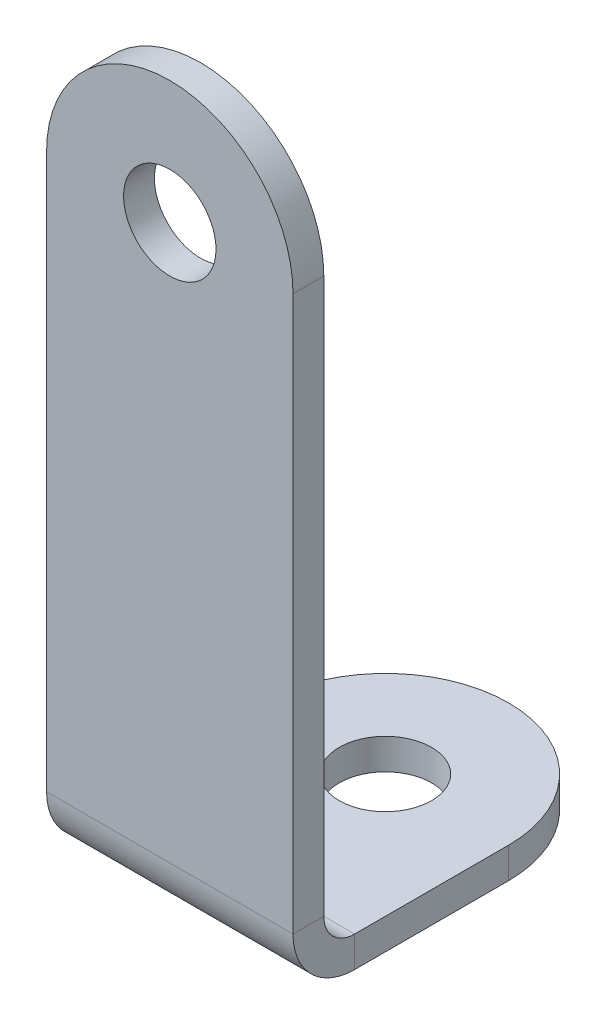
ISO-10303-21;
HEADER;
FILE_DESCRIPTION(('STEP AP214'),'2;1');
FILE_NAME('part.step','',(''),(''),'','','');
FILE_SCHEMA(('AUTOMOTIVE_DESIGN { 1 0 10303 214 1 1 1 1 }'));
ENDSEC;
DATA;
#1=APPLICATION_CONTEXT('core data for automotive mechanical design processes');
#2=APPLICATION_PROTOCOL_DEFINITION('international standard','automotive_design',2000,#1);
#3=PRODUCT_CONTEXT('',#1,'mechanical');
#4=PRODUCT('Part','Part','',(#3));
#5=PRODUCT_RELATED_PRODUCT_CATEGORY('part','',(#4));
#6=PRODUCT_DEFINITION_FORMATION('','',#4);
#7=PRODUCT_DEFINITION_CONTEXT('part definition',#1,'design');
#8=PRODUCT_DEFINITION('design','',#6,#7);
#9=PRODUCT_DEFINITION_SHAPE('','',#8);
#10=(LENGTH_UNIT() NAMED_UNIT(*) SI_UNIT(.MILLI.,.METRE.));
#11=(NAMED_UNIT(*) PLANE_ANGLE_UNIT() SI_UNIT($,.RADIAN.));
#12=(NAMED_UNIT(*) SI_UNIT($,.STERADIAN.) SOLID_ANGLE_UNIT());
#13=UNCERTAINTY_MEASURE_WITH_UNIT(LENGTH_MEASURE(1.E-05),#10,'distance_accuracy_value','');
#14=(GEOMETRIC_REPRESENTATION_CONTEXT(3) GLOBAL_UNCERTAINTY_ASSIGNED_CONTEXT((#13)) GLOBAL_UNIT_ASSIGNED_CONTEXT((#10,
#11,#12)) REPRESENTATION_CONTEXT('',''));
#15=CARTESIAN_POINT('',(0.,0.,0.));
#16=DIRECTION('',(0.,0.,1.));
#17=DIRECTION('',(1.,0.,0.));
#18=AXIS2_PLACEMENT_3D('',#15,#16,#17);
#19=CARTESIAN_POINT('',(-4.,23.,0.));
#20=DIRECTION('',(1.,0.,0.));
#21=DIRECTION('',(0.,-1.,0.));
#22=AXIS2_PLACEMENT_3D('',#19,#20,#21);
#23=PLANE('',#22);
#24=DIRECTION('',(0.,0.,-1.));
#25=VECTOR('',#24,1.);
#26=CARTESIAN_POINT('',(-4.,1.,0.));
#27=LINE('',#26,#25);
#28=CARTESIAN_POINT('',(-4.,1.,1.));
#29=VERTEX_POINT('',#28);
#30=CARTESIAN_POINT('',(-4.,1.,0.));
#31=VERTEX_POINT('',#30);
#32=EDGE_CURVE('E11',#29,#31,#27,.T.);
#33=ORIENTED_EDGE('',*,*,#32,.F.);
#34=DIRECTION('',(0.,1.,0.));
#35=VECTOR('',#34,1.);
#36=CARTESIAN_POINT('',(-4.,23.,1.));
#37=LINE('',#36,#35);
#38=CARTESIAN_POINT('',(-4.,19.,1.));
#39=VERTEX_POINT('',#38);
#40=EDGE_CURVE('E135',#39,#29,#37,.F.);
#41=ORIENTED_EDGE('',*,*,#40,.F.);
#42=DIRECTION('',(0.,0.,-1.));
#43=VECTOR('',#42,1.);
#44=CARTESIAN_POINT('',(-4.,19.,0.));
#45=LINE('',#44,#43);
#46=CARTESIAN_POINT('',(-4.,19.,0.));
#47=VERTEX_POINT('',#46);
#48=EDGE_CURVE('E45',#39,#47,#45,.T.);
#49=ORIENTED_EDGE('',*,*,#48,.T.);
#50=DIRECTION('',(0.,-1.,0.));
#51=VECTOR('',#50,1.);
#52=CARTESIAN_POINT('',(-4.,23.,0.));
#53=LINE('',#52,#51);
#54=EDGE_CURVE('E156',#47,#31,#53,.T.);
#55=ORIENTED_EDGE('',*,*,#54,.T.);
#56=EDGE_LOOP('',(#33,#41,#49,#55));
#57=FACE_BOUND('',#56,.T.);
#58=ADVANCED_FACE('F35',(#57),#23,.F.);
#59=CARTESIAN_POINT('',(0.,19.,0.));
#60=DIRECTION('',(0.,0.,-1.));
#61=DIRECTION('',(0.,1.,0.));
#62=AXIS2_PLACEMENT_3D('',#59,#60,#61);
#63=CYLINDRICAL_SURFACE('',#62,4.);
#64=ORIENTED_EDGE('',*,*,#48,.F.);
#65=CARTESIAN_POINT('',(0.,19.,1.));
#66=DIRECTION('',(0.,0.,-1.));
#67=DIRECTION('',(0.,1.,0.));
#68=AXIS2_PLACEMENT_3D('',#65,#66,#67);
#69=CIRCLE('',#68,4.);
#70=CARTESIAN_POINT('',(4.,19.,1.));
#71=VERTEX_POINT('',#70);
#72=EDGE_CURVE('E136',#71,#39,#69,.F.);
#73=ORIENTED_EDGE('',*,*,#72,.F.);
#74=DIRECTION('',(0.,0.,-1.));
#75=VECTOR('',#74,1.);
#76=CARTESIAN_POINT('',(4.,19.,0.));
#77=LINE('',#76,#75);
#78=CARTESIAN_POINT('',(4.,19.,0.));
#79=VERTEX_POINT('',#78);
#80=EDGE_CURVE('E150',#71,#79,#77,.T.);
#81=ORIENTED_EDGE('',*,*,#80,.T.);
#82=CARTESIAN_POINT('',(0.,19.,0.));
#83=DIRECTION('',(0.,0.,-1.));
#84=DIRECTION('',(0.,1.,0.));
#85=AXIS2_PLACEMENT_3D('',#82,#83,#84);
#86=CIRCLE('',#85,4.);
#87=EDGE_CURVE('E167',#79,#47,#86,.F.);
#88=ORIENTED_EDGE('',*,*,#87,.T.);
#89=EDGE_LOOP('',(#64,#73,#81,#88));
#90=FACE_BOUND('',#89,.T.);
#91=ADVANCED_FACE('F174',(#90),#63,.T.);
#92=CARTESIAN_POINT('',(4.,23.,0.));
#93=DIRECTION('',(1.,0.,0.));
#94=DIRECTION('',(0.,-1.,0.));
#95=AXIS2_PLACEMENT_3D('',#92,#93,#94);
#96=PLANE('',#95);
#97=ORIENTED_EDGE('',*,*,#80,.F.);
#98=DIRECTION('',(0.,1.,0.));
#99=VECTOR('',#98,1.);
#100=CARTESIAN_POINT('',(4.,23.,1.));
#101=LINE('',#100,#99);
#102=CARTESIAN_POINT('',(4.,1.,1.));
#103=VERTEX_POINT('',#102);
#104=EDGE_CURVE('E132',#71,#103,#101,.F.);
#105=ORIENTED_EDGE('',*,*,#104,.T.);
#106=DIRECTION('',(0.,0.,-1.));
#107=VECTOR('',#106,1.);
#108=CARTESIAN_POINT('',(4.,1.,0.));
#109=LINE('',#108,#107);
#110=CARTESIAN_POINT('',(4.,1.,0.));
#111=VERTEX_POINT('',#110);
#112=EDGE_CURVE('E147',#103,#111,#109,.T.);
#113=ORIENTED_EDGE('',*,*,#112,.T.);
#114=DIRECTION('',(0.,-1.,0.));
#115=VECTOR('',#114,1.);
#116=CARTESIAN_POINT('',(4.,23.,0.));
#117=LINE('',#116,#115);
#118=EDGE_CURVE('E172',#79,#111,#117,.T.);
#119=ORIENTED_EDGE('',*,*,#118,.F.);
#120=EDGE_LOOP('',(#97,#105,#113,#119));
#121=FACE_BOUND('',#120,.T.);
#122=ADVANCED_FACE('F212',(#121),#96,.T.);
#123=CARTESIAN_POINT('',(4.,1.,-1.));
#124=DIRECTION('',(1.,0.,0.));
#125=DIRECTION('',(0.,0.,-1.));
#126=AXIS2_PLACEMENT_3D('',#123,#124,#125);
#127=PLANE('',#126);
#128=ORIENTED_EDGE('',*,*,#112,.F.);
#129=CARTESIAN_POINT('',(4.,1.,-1.));
#130=DIRECTION('',(1.,0.,0.));
#131=DIRECTION('',(0.,0.,-1.));
#132=AXIS2_PLACEMENT_3D('',#129,#130,#131);
#133=CIRCLE('',#132,2.);
#134=CARTESIAN_POINT('',(4.,-0.999999999999999,-1.));
#135=VERTEX_POINT('',#134);
#136=EDGE_CURVE('E118',#103,#135,#133,.T.);
#137=ORIENTED_EDGE('',*,*,#136,.T.);
#138=DIRECTION('',(0.,1.,0.));
#139=VECTOR('',#138,1.);
#140=CARTESIAN_POINT('',(4.,0.,-1.));
#141=LINE('',#140,#139);
#142=CARTESIAN_POINT('',(4.,0.,-1.));
#143=VERTEX_POINT('',#142);
#144=EDGE_CURVE('E53',#135,#143,#141,.T.);
#145=ORIENTED_EDGE('',*,*,#144,.T.);
#146=CARTESIAN_POINT('',(4.,1.,-1.));
#147=DIRECTION('',(-1.,0.,0.));
#148=DIRECTION('',(0.,0.,1.));
#149=AXIS2_PLACEMENT_3D('',#146,#147,#148);
#150=CIRCLE('',#149,1.);
#151=EDGE_CURVE('E179',#111,#143,#150,.F.);
#152=ORIENTED_EDGE('',*,*,#151,.F.);
#153=EDGE_LOOP('',(#128,#137,#145,#152));
#154=FACE_BOUND('',#153,.T.);
#155=ADVANCED_FACE('F214',(#154),#127,.T.);
#156=CARTESIAN_POINT('',(4.,0.,0.));
#157=DIRECTION('',(1.,0.,0.));
#158=DIRECTION('',(0.,0.,-1.));
#159=AXIS2_PLACEMENT_3D('',#156,#157,#158);
#160=PLANE('',#159);
#161=ORIENTED_EDGE('',*,*,#144,.F.);
#162=DIRECTION('',(0.,0.,1.));
#163=VECTOR('',#162,1.);
#164=CARTESIAN_POINT('',(4.,-1.,0.));
#165=LINE('',#164,#163);
#166=CARTESIAN_POINT('',(4.,-1.,-6.));
#167=VERTEX_POINT('',#166);
#168=EDGE_CURVE('E110',#135,#167,#165,.F.);
#169=ORIENTED_EDGE('',*,*,#168,.T.);
#170=DIRECTION('',(0.,1.,0.));
#171=VECTOR('',#170,1.);
#172=CARTESIAN_POINT('',(4.,0.,-6.));
#173=LINE('',#172,#171);
#174=CARTESIAN_POINT('',(4.,0.,-6.));
#175=VERTEX_POINT('',#174);
#176=EDGE_CURVE('E143',#167,#175,#173,.T.);
#177=ORIENTED_EDGE('',*,*,#176,.T.);
#178=DIRECTION('',(0.,0.,-1.));
#179=VECTOR('',#178,1.);
#180=CARTESIAN_POINT('',(4.,0.,0.));
#181=LINE('',#180,#179);
#182=EDGE_CURVE('E189',#143,#175,#181,.T.);
#183=ORIENTED_EDGE('',*,*,#182,.F.);
#184=EDGE_LOOP('',(#161,#169,#177,#183));
#185=FACE_BOUND('',#184,.T.);
#186=ADVANCED_FACE('F201',(#185),#160,.T.);
#187=CARTESIAN_POINT('',(0.,0.,-6.));
#188=DIRECTION('',(0.,1.,0.));
#189=DIRECTION('',(0.,0.,1.));
#190=AXIS2_PLACEMENT_3D('',#187,#188,#189);
#191=CYLINDRICAL_SURFACE('',#190,4.);
#192=ORIENTED_EDGE('',*,*,#176,.F.);
#193=CARTESIAN_POINT('',(0.,-1.,-6.));
#194=DIRECTION('',(0.,1.,0.));
#195=DIRECTION('',(0.,0.,1.));
#196=AXIS2_PLACEMENT_3D('',#193,#194,#195);
#197=CIRCLE('',#196,4.);
#198=CARTESIAN_POINT('',(-4.,-1.,-6.));
#199=VERTEX_POINT('',#198);
#200=EDGE_CURVE('E122',#199,#167,#197,.F.);
#201=ORIENTED_EDGE('',*,*,#200,.F.);
#202=DIRECTION('',(0.,1.,0.));
#203=VECTOR('',#202,1.);
#204=CARTESIAN_POINT('',(-4.,0.,-6.));
#205=LINE('',#204,#203);
#206=CARTESIAN_POINT('',(-4.,0.,-6.));
#207=VERTEX_POINT('',#206);
#208=EDGE_CURVE('E98',#199,#207,#205,.T.);
#209=ORIENTED_EDGE('',*,*,#208,.T.);
#210=CARTESIAN_POINT('',(0.,0.,-6.));
#211=DIRECTION('',(0.,1.,0.));
#212=DIRECTION('',(0.,0.,1.));
#213=AXIS2_PLACEMENT_3D('',#210,#211,#212);
#214=CIRCLE('',#213,4.);
#215=EDGE_CURVE('E184',#207,#175,#214,.F.);
#216=ORIENTED_EDGE('',*,*,#215,.T.);
#217=EDGE_LOOP('',(#192,#201,#209,#216));
#218=FACE_BOUND('',#217,.T.);
#219=ADVANCED_FACE('F252',(#218),#191,.T.);
#220=CARTESIAN_POINT('',(-4.,0.,0.));
#221=DIRECTION('',(1.,0.,0.));
#222=DIRECTION('',(0.,0.,-1.));
#223=AXIS2_PLACEMENT_3D('',#220,#221,#222);
#224=PLANE('',#223);
#225=ORIENTED_EDGE('',*,*,#208,.F.);
#226=DIRECTION('',(0.,0.,1.));
#227=VECTOR('',#226,1.);
#228=CARTESIAN_POINT('',(-4.,-1.,0.));
#229=LINE('',#228,#227);
#230=CARTESIAN_POINT('',(-4.,-1.,-1.));
#231=VERTEX_POINT('',#230);
#232=EDGE_CURVE('E107',#231,#199,#229,.F.);
#233=ORIENTED_EDGE('',*,*,#232,.F.);
#234=DIRECTION('',(0.,1.,0.));
#235=VECTOR('',#234,1.);
#236=CARTESIAN_POINT('',(-4.,0.,-1.));
#237=LINE('',#236,#235);
#238=CARTESIAN_POINT('',(-4.,0.,-1.));
#239=VERTEX_POINT('',#238);
#240=EDGE_CURVE('E39',#231,#239,#237,.T.);
#241=ORIENTED_EDGE('',*,*,#240,.T.);
#242=DIRECTION('',(0.,0.,-1.));
#243=VECTOR('',#242,1.);
#244=CARTESIAN_POINT('',(-4.,0.,0.));
#245=LINE('',#244,#243);
#246=EDGE_CURVE('E187',#239,#207,#245,.T.);
#247=ORIENTED_EDGE('',*,*,#246,.T.);
#248=EDGE_LOOP('',(#225,#233,#241,#247));
#249=FACE_BOUND('',#248,.T.);
#250=ADVANCED_FACE('F120',(#249),#224,.F.);
#251=CARTESIAN_POINT('',(0.,19.,0.));
#252=DIRECTION('',(0.,0.,-1.));
#253=DIRECTION('',(0.,1.,0.));
#254=AXIS2_PLACEMENT_3D('',#251,#252,#253);
#255=CYLINDRICAL_SURFACE('',#254,1.5);
#256=CARTESIAN_POINT('',(0.,19.,0.));
#257=DIRECTION('',(0.,0.,-1.));
#258=DIRECTION('',(0.,1.,0.));
#259=AXIS2_PLACEMENT_3D('',#256,#257,#258);
#260=CIRCLE('',#259,1.5);
#261=CARTESIAN_POINT('',(0.,20.5,0.));
#262=VERTEX_POINT('',#261);
#263=EDGE_CURVE('E175',#262,#262,#260,.T.);
#264=ORIENTED_EDGE('',*,*,#263,.T.);
#265=EDGE_LOOP('',(#264));
#266=FACE_BOUND('',#265,.T.);
#267=CARTESIAN_POINT('',(0.,19.,1.));
#268=DIRECTION('',(0.,0.,-1.));
#269=DIRECTION('',(0.,1.,0.));
#270=AXIS2_PLACEMENT_3D('',#267,#268,#269);
#271=CIRCLE('',#270,1.5);
#272=CARTESIAN_POINT('',(0.,20.5,1.));
#273=VERTEX_POINT('',#272);
#274=EDGE_CURVE('E131',#273,#273,#271,.T.);
#275=ORIENTED_EDGE('',*,*,#274,.F.);
#276=EDGE_LOOP('',(#275));
#277=FACE_BOUND('',#276,.T.);
#278=ADVANCED_FACE('F37',(#266,#277),#255,.F.);
#279=CARTESIAN_POINT('',(0.,0.,-6.));
#280=DIRECTION('',(0.,1.,0.));
#281=DIRECTION('',(0.,0.,1.));
#282=AXIS2_PLACEMENT_3D('',#279,#280,#281);
#283=CYLINDRICAL_SURFACE('',#282,1.5);
#284=CARTESIAN_POINT('',(0.,0.,-6.));
#285=DIRECTION('',(0.,1.,0.));
#286=DIRECTION('',(0.,0.,1.));
#287=AXIS2_PLACEMENT_3D('',#284,#285,#286);
#288=CIRCLE('',#287,1.5);
#289=CARTESIAN_POINT('',(0.,0.,-4.5));
#290=VERTEX_POINT('',#289);
#291=EDGE_CURVE('E171',#290,#290,#288,.T.);
#292=ORIENTED_EDGE('',*,*,#291,.T.);
#293=EDGE_LOOP('',(#292));
#294=FACE_BOUND('',#293,.T.);
#295=CARTESIAN_POINT('',(0.,-1.,-6.));
#296=DIRECTION('',(0.,1.,0.));
#297=DIRECTION('',(0.,0.,1.));
#298=AXIS2_PLACEMENT_3D('',#295,#296,#297);
#299=CIRCLE('',#298,1.5);
#300=CARTESIAN_POINT('',(0.,-1.,-4.5));
#301=VERTEX_POINT('',#300);
#302=EDGE_CURVE('E125',#301,#301,#299,.T.);
#303=ORIENTED_EDGE('',*,*,#302,.F.);
#304=EDGE_LOOP('',(#303));
#305=FACE_BOUND('',#304,.T.);
#306=ADVANCED_FACE('F235',(#294,#305),#283,.F.);
#307=CARTESIAN_POINT('',(-4.,1.,-1.));
#308=DIRECTION('',(-1.,0.,0.));
#309=DIRECTION('',(0.,0.,1.));
#310=AXIS2_PLACEMENT_3D('',#307,#308,#309);
#311=PLANE('',#310);
#312=CARTESIAN_POINT('',(-4.,1.,-1.));
#313=DIRECTION('',(1.,0.,0.));
#314=DIRECTION('',(0.,0.,-1.));
#315=AXIS2_PLACEMENT_3D('',#312,#313,#314);
#316=CIRCLE('',#315,2.);
#317=EDGE_CURVE('E90',#231,#29,#316,.F.);
#318=ORIENTED_EDGE('',*,*,#317,.T.);
#319=ORIENTED_EDGE('',*,*,#32,.T.);
#320=CARTESIAN_POINT('',(-4.,1.,-1.));
#321=DIRECTION('',(1.,0.,0.));
#322=DIRECTION('',(0.,0.,-1.));
#323=AXIS2_PLACEMENT_3D('',#320,#321,#322);
#324=CIRCLE('',#323,1.);
#325=EDGE_CURVE('E92',#239,#31,#324,.F.);
#326=ORIENTED_EDGE('',*,*,#325,.F.);
#327=ORIENTED_EDGE('',*,*,#240,.F.);
#328=EDGE_LOOP('',(#318,#319,#326,#327));
#329=FACE_BOUND('',#328,.T.);
#330=ADVANCED_FACE('F88',(#329),#311,.T.);
#331=CARTESIAN_POINT('',(4.,0.,0.));
#332=DIRECTION('',(0.,1.,0.));
#333=DIRECTION('',(0.,0.,1.));
#334=AXIS2_PLACEMENT_3D('',#331,#332,#333);
#335=PLANE('',#334);
#336=ORIENTED_EDGE('',*,*,#291,.F.);
#337=EDGE_LOOP('',(#336));
#338=FACE_BOUND('',#337,.T.);
#339=ORIENTED_EDGE('',*,*,#246,.F.);
#340=DIRECTION('',(-1.,0.,0.));
#341=VECTOR('',#340,1.);
#342=CARTESIAN_POINT('',(4.,0.,-1.));
#343=LINE('',#342,#341);
#344=EDGE_CURVE('E99',#239,#143,#343,.F.);
#345=ORIENTED_EDGE('',*,*,#344,.T.);
#346=ORIENTED_EDGE('',*,*,#182,.T.);
#347=ORIENTED_EDGE('',*,*,#215,.F.);
#348=EDGE_LOOP('',(#339,#345,#346,#347));
#349=FACE_BOUND('',#348,.T.);
#350=ADVANCED_FACE('F205',(#338,#349),#335,.T.);
#351=CARTESIAN_POINT('',(4.,23.,0.));
#352=DIRECTION('',(0.,0.,-1.));
#353=DIRECTION('',(0.,1.,0.));
#354=AXIS2_PLACEMENT_3D('',#351,#352,#353);
#355=PLANE('',#354);
#356=ORIENTED_EDGE('',*,*,#263,.F.);
#357=EDGE_LOOP('',(#356));
#358=FACE_BOUND('',#357,.T.);
#359=ORIENTED_EDGE('',*,*,#118,.T.);
#360=DIRECTION('',(-1.,0.,0.));
#361=VECTOR('',#360,1.);
#362=CARTESIAN_POINT('',(-4.,1.,0.));
#363=LINE('',#362,#361);
#364=EDGE_CURVE('E170',#111,#31,#363,.T.);
#365=ORIENTED_EDGE('',*,*,#364,.T.);
#366=ORIENTED_EDGE('',*,*,#54,.F.);
#367=ORIENTED_EDGE('',*,*,#87,.F.);
#368=EDGE_LOOP('',(#359,#365,#366,#367));
#369=FACE_BOUND('',#368,.T.);
#370=ADVANCED_FACE('F166',(#358,#369),#355,.T.);
#371=CARTESIAN_POINT('',(4.,1.,-1.));
#372=DIRECTION('',(1.,0.,0.));
#373=DIRECTION('',(0.,0.,-1.));
#374=AXIS2_PLACEMENT_3D('',#371,#372,#373);
#375=CYLINDRICAL_SURFACE('',#374,1.);
#376=ORIENTED_EDGE('',*,*,#151,.T.);
#377=ORIENTED_EDGE('',*,*,#344,.F.);
#378=ORIENTED_EDGE('',*,*,#325,.T.);
#379=ORIENTED_EDGE('',*,*,#364,.F.);
#380=EDGE_LOOP('',(#376,#377,#378,#379));
#381=FACE_BOUND('',#380,.T.);
#382=ADVANCED_FACE('F198',(#381),#375,.F.);
#383=CARTESIAN_POINT('',(4.,-1.,0.));
#384=DIRECTION('',(0.,1.,0.));
#385=DIRECTION('',(0.,0.,1.));
#386=AXIS2_PLACEMENT_3D('',#383,#384,#385);
#387=PLANE('',#386);
#388=ORIENTED_EDGE('',*,*,#302,.T.);
#389=EDGE_LOOP('',(#388));
#390=FACE_BOUND('',#389,.T.);
#391=ORIENTED_EDGE('',*,*,#232,.T.);
#392=ORIENTED_EDGE('',*,*,#200,.T.);
#393=ORIENTED_EDGE('',*,*,#168,.F.);
#394=DIRECTION('',(1.,0.,0.));
#395=VECTOR('',#394,1.);
#396=CARTESIAN_POINT('',(4.,-1.,-1.));
#397=LINE('',#396,#395);
#398=EDGE_CURVE('E104',#231,#135,#397,.T.);
#399=ORIENTED_EDGE('',*,*,#398,.F.);
#400=EDGE_LOOP('',(#391,#392,#393,#399));
#401=FACE_BOUND('',#400,.T.);
#402=ADVANCED_FACE('F105',(#390,#401),#387,.F.);
#403=CARTESIAN_POINT('',(4.,23.,1.));
#404=DIRECTION('',(0.,0.,-1.));
#405=DIRECTION('',(0.,1.,0.));
#406=AXIS2_PLACEMENT_3D('',#403,#404,#405);
#407=PLANE('',#406);
#408=ORIENTED_EDGE('',*,*,#274,.T.);
#409=EDGE_LOOP('',(#408));
#410=FACE_BOUND('',#409,.T.);
#411=ORIENTED_EDGE('',*,*,#104,.F.);
#412=ORIENTED_EDGE('',*,*,#72,.T.);
#413=ORIENTED_EDGE('',*,*,#40,.T.);
#414=DIRECTION('',(1.,0.,0.));
#415=VECTOR('',#414,1.);
#416=CARTESIAN_POINT('',(4.,1.,1.));
#417=LINE('',#416,#415);
#418=EDGE_CURVE('E113',#103,#29,#417,.F.);
#419=ORIENTED_EDGE('',*,*,#418,.F.);
#420=EDGE_LOOP('',(#411,#412,#413,#419));
#421=FACE_BOUND('',#420,.T.);
#422=ADVANCED_FACE('F216',(#410,#421),#407,.F.);
#423=CARTESIAN_POINT('',(4.,1.,-1.));
#424=DIRECTION('',(1.,0.,0.));
#425=DIRECTION('',(0.,0.,-1.));
#426=AXIS2_PLACEMENT_3D('',#423,#424,#425);
#427=CYLINDRICAL_SURFACE('',#426,2.);
#428=ORIENTED_EDGE('',*,*,#136,.F.);
#429=ORIENTED_EDGE('',*,*,#418,.T.);
#430=ORIENTED_EDGE('',*,*,#317,.F.);
#431=ORIENTED_EDGE('',*,*,#398,.T.);
#432=EDGE_LOOP('',(#428,#429,#430,#431));
#433=FACE_BOUND('',#432,.T.);
#434=ADVANCED_FACE('F115',(#433),#427,.T.);
#435=CLOSED_SHELL('',(#58,#91,#122,#155,#186,#219,#250,#278,#306,#330,#350,#370,#382,#402,#422,#434));
#436=MANIFOLD_SOLID_BREP('B2',#435);
#437=ADVANCED_BREP_SHAPE_REPRESENTATION('',(#18,#436),#14);
#438=SHAPE_DEFINITION_REPRESENTATION(#9,#437);
ENDSEC;
END-ISO-10303-21;
